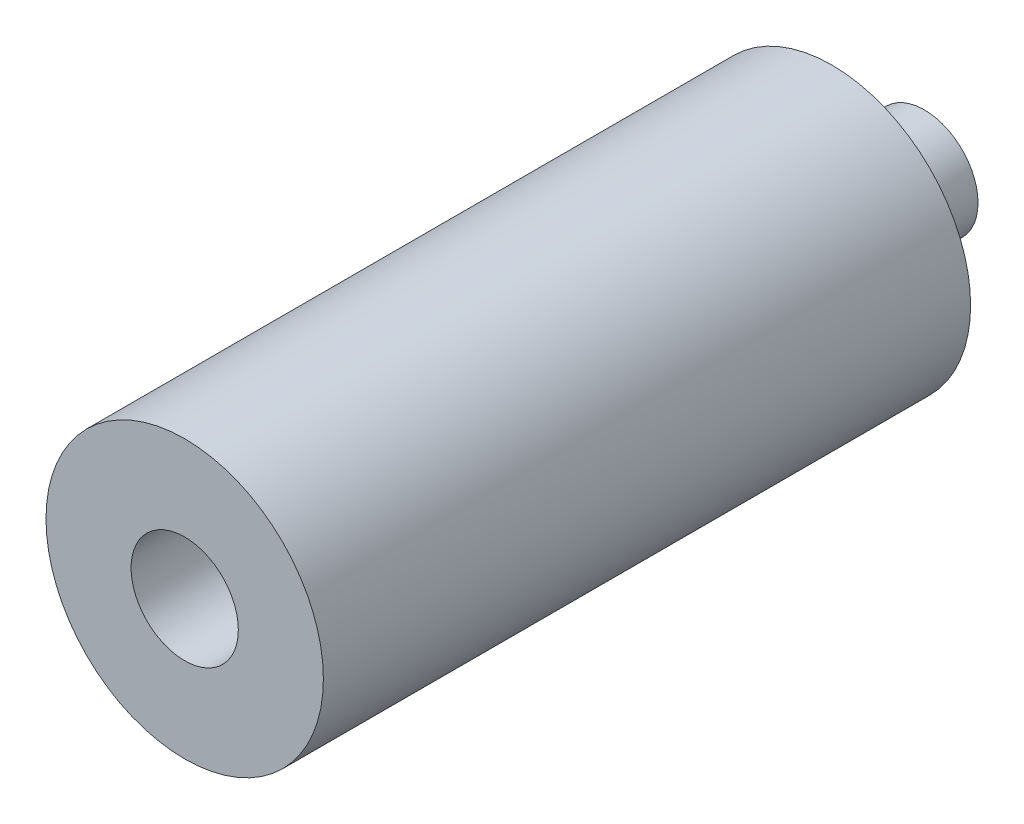
ISO-10303-21;
HEADER;
FILE_DESCRIPTION(('STEP AP214'),'2;1');
FILE_NAME('part.step','',(''),(''),'','','');
FILE_SCHEMA(('AUTOMOTIVE_DESIGN { 1 0 10303 214 1 1 1 1 }'));
ENDSEC;
DATA;
#1=APPLICATION_CONTEXT('core data for automotive mechanical design processes');
#2=APPLICATION_PROTOCOL_DEFINITION('international standard','automotive_design',2000,#1);
#3=PRODUCT_CONTEXT('',#1,'mechanical');
#4=PRODUCT('Part','Part','',(#3));
#5=PRODUCT_RELATED_PRODUCT_CATEGORY('part','',(#4));
#6=PRODUCT_DEFINITION_FORMATION('','',#4);
#7=PRODUCT_DEFINITION_CONTEXT('part definition',#1,'design');
#8=PRODUCT_DEFINITION('design','',#6,#7);
#9=PRODUCT_DEFINITION_SHAPE('','',#8);
#10=(LENGTH_UNIT() NAMED_UNIT(*) SI_UNIT(.MILLI.,.METRE.));
#11=(NAMED_UNIT(*) PLANE_ANGLE_UNIT() SI_UNIT($,.RADIAN.));
#12=(NAMED_UNIT(*) SI_UNIT($,.STERADIAN.) SOLID_ANGLE_UNIT());
#13=UNCERTAINTY_MEASURE_WITH_UNIT(LENGTH_MEASURE(1.E-05),#10,'distance_accuracy_value','');
#14=(GEOMETRIC_REPRESENTATION_CONTEXT(3) GLOBAL_UNCERTAINTY_ASSIGNED_CONTEXT((#13)) GLOBAL_UNIT_ASSIGNED_CONTEXT((#10,
#11,#12)) REPRESENTATION_CONTEXT('',''));
#15=CARTESIAN_POINT('',(0.,0.,0.));
#16=DIRECTION('',(0.,0.,1.));
#17=DIRECTION('',(1.,0.,0.));
#18=AXIS2_PLACEMENT_3D('',#15,#16,#17);
#19=CARTESIAN_POINT('',(0.,0.,-5.));
#20=DIRECTION('',(0.,0.,1.));
#21=DIRECTION('',(1.,0.,0.));
#22=AXIS2_PLACEMENT_3D('',#19,#20,#21);
#23=CYLINDRICAL_SURFACE('',#22,2.9);
#24=CARTESIAN_POINT('',(0.,0.,-5.));
#25=DIRECTION('',(0.,0.,1.));
#26=DIRECTION('',(1.,0.,0.));
#27=AXIS2_PLACEMENT_3D('',#24,#25,#26);
#28=CIRCLE('',#27,2.9);
#29=CARTESIAN_POINT('',(2.9,0.,-5.));
#30=VERTEX_POINT('',#29);
#31=EDGE_CURVE('E11',#30,#30,#28,.T.);
#32=ORIENTED_EDGE('',*,*,#31,.T.);
#33=EDGE_LOOP('',(#32));
#34=FACE_BOUND('',#33,.T.);
#35=CARTESIAN_POINT('',(0.,0.,0.));
#36=DIRECTION('',(0.,0.,1.));
#37=DIRECTION('',(1.,0.,0.));
#38=AXIS2_PLACEMENT_3D('',#35,#36,#37);
#39=CIRCLE('',#38,2.9);
#40=CARTESIAN_POINT('',(2.9,0.,0.));
#41=VERTEX_POINT('',#40);
#42=EDGE_CURVE('E42',#41,#41,#39,.T.);
#43=ORIENTED_EDGE('',*,*,#42,.F.);
#44=EDGE_LOOP('',(#43));
#45=FACE_BOUND('',#44,.T.);
#46=ADVANCED_FACE('F39',(#34,#45),#23,.T.);
#47=CARTESIAN_POINT('',(0.,0.,-5.));
#48=DIRECTION('',(0.,0.,1.));
#49=DIRECTION('',(1.,0.,0.));
#50=AXIS2_PLACEMENT_3D('',#47,#48,#49);
#51=PLANE('',#50);
#52=ORIENTED_EDGE('',*,*,#31,.F.);
#53=EDGE_LOOP('',(#52));
#54=FACE_BOUND('',#53,.T.);
#55=ADVANCED_FACE('F54',(#54),#51,.F.);
#56=CARTESIAN_POINT('',(0.,0.,0.));
#57=DIRECTION('',(0.,0.,1.));
#58=DIRECTION('',(1.,0.,0.));
#59=AXIS2_PLACEMENT_3D('',#56,#57,#58);
#60=PLANE('',#59);
#61=ORIENTED_EDGE('',*,*,#42,.T.);
#62=EDGE_LOOP('',(#61));
#63=FACE_BOUND('',#62,.T.);
#64=ADVANCED_FACE('F51',(#63),#60,.T.);
#65=CLOSED_SHELL('',(#46,#55,#64));
#66=MANIFOLD_SOLID_BREP('B2',#65);
#67=CARTESIAN_POINT('',(0.,0.,35.));
#68=DIRECTION('',(0.,0.,1.));
#69=DIRECTION('',(1.,0.,0.));
#70=AXIS2_PLACEMENT_3D('',#67,#68,#69);
#71=PLANE('',#70);
#72=CARTESIAN_POINT('',(0.,0.,35.));
#73=DIRECTION('',(0.,0.,1.));
#74=DIRECTION('',(1.,0.,0.));
#75=AXIS2_PLACEMENT_3D('',#72,#73,#74);
#76=CIRCLE('',#75,7.5);
#77=CARTESIAN_POINT('',(7.5,0.,35.));
#78=VERTEX_POINT('',#77);
#79=EDGE_CURVE('E38',#78,#78,#76,.T.);
#80=ORIENTED_EDGE('',*,*,#79,.T.);
#81=EDGE_LOOP('',(#80));
#82=FACE_BOUND('',#81,.T.);
#83=CARTESIAN_POINT('',(0.,0.,35.));
#84=DIRECTION('',(0.,0.,1.));
#85=DIRECTION('',(1.,0.,0.));
#86=AXIS2_PLACEMENT_3D('',#83,#84,#85);
#87=CIRCLE('',#86,2.9);
#88=CARTESIAN_POINT('',(2.9,0.,35.));
#89=VERTEX_POINT('',#88);
#90=EDGE_CURVE('E91',#89,#89,#87,.T.);
#91=ORIENTED_EDGE('',*,*,#90,.F.);
#92=EDGE_LOOP('',(#91));
#93=FACE_BOUND('',#92,.T.);
#94=ADVANCED_FACE('F80',(#82,#93),#71,.T.);
#95=CARTESIAN_POINT('',(0.,0.,0.));
#96=DIRECTION('',(0.,0.,1.));
#97=DIRECTION('',(1.,0.,0.));
#98=AXIS2_PLACEMENT_3D('',#95,#96,#97);
#99=PLANE('',#98);
#100=CARTESIAN_POINT('',(0.,0.,0.));
#101=DIRECTION('',(0.,0.,1.));
#102=DIRECTION('',(1.,0.,0.));
#103=AXIS2_PLACEMENT_3D('',#100,#101,#102);
#104=CIRCLE('',#103,7.5);
#105=CARTESIAN_POINT('',(7.5,0.,0.));
#106=VERTEX_POINT('',#105);
#107=EDGE_CURVE('E84',#106,#106,#104,.T.);
#108=ORIENTED_EDGE('',*,*,#107,.F.);
#109=EDGE_LOOP('',(#108));
#110=FACE_BOUND('',#109,.T.);
#111=CARTESIAN_POINT('',(0.,0.,0.));
#112=DIRECTION('',(0.,0.,1.));
#113=DIRECTION('',(1.,0.,0.));
#114=AXIS2_PLACEMENT_3D('',#111,#112,#113);
#115=CIRCLE('',#114,2.9);
#116=CARTESIAN_POINT('',(2.9,0.,0.));
#117=VERTEX_POINT('',#116);
#118=EDGE_CURVE('E93',#117,#117,#115,.T.);
#119=ORIENTED_EDGE('',*,*,#118,.T.);
#120=EDGE_LOOP('',(#119));
#121=FACE_BOUND('',#120,.T.);
#122=ADVANCED_FACE('F103',(#110,#121),#99,.F.);
#123=CARTESIAN_POINT('',(0.,0.,35.));
#124=DIRECTION('',(0.,0.,-1.));
#125=DIRECTION('',(-1.,0.,0.));
#126=AXIS2_PLACEMENT_3D('',#123,#124,#125);
#127=CYLINDRICAL_SURFACE('',#126,7.5);
#128=ORIENTED_EDGE('',*,*,#79,.F.);
#129=EDGE_LOOP('',(#128));
#130=FACE_BOUND('',#129,.T.);
#131=ORIENTED_EDGE('',*,*,#107,.T.);
#132=EDGE_LOOP('',(#131));
#133=FACE_BOUND('',#132,.T.);
#134=ADVANCED_FACE('F82',(#130,#133),#127,.T.);
#135=CARTESIAN_POINT('',(0.,0.,35.));
#136=DIRECTION('',(0.,0.,-1.));
#137=DIRECTION('',(-1.,0.,0.));
#138=AXIS2_PLACEMENT_3D('',#135,#136,#137);
#139=CYLINDRICAL_SURFACE('',#138,2.9);
#140=ORIENTED_EDGE('',*,*,#90,.T.);
#141=EDGE_LOOP('',(#140));
#142=FACE_BOUND('',#141,.T.);
#143=ORIENTED_EDGE('',*,*,#118,.F.);
#144=EDGE_LOOP('',(#143));
#145=FACE_BOUND('',#144,.T.);
#146=ADVANCED_FACE('F99',(#142,#145),#139,.F.);
#147=CLOSED_SHELL('',(#94,#122,#134,#146));
#148=MANIFOLD_SOLID_BREP('B6',#147);
#149=ADVANCED_BREP_SHAPE_REPRESENTATION('',(#18,#66,#148),#14);
#150=SHAPE_DEFINITION_REPRESENTATION(#9,#149);
ENDSEC;
END-ISO-10303-21;
